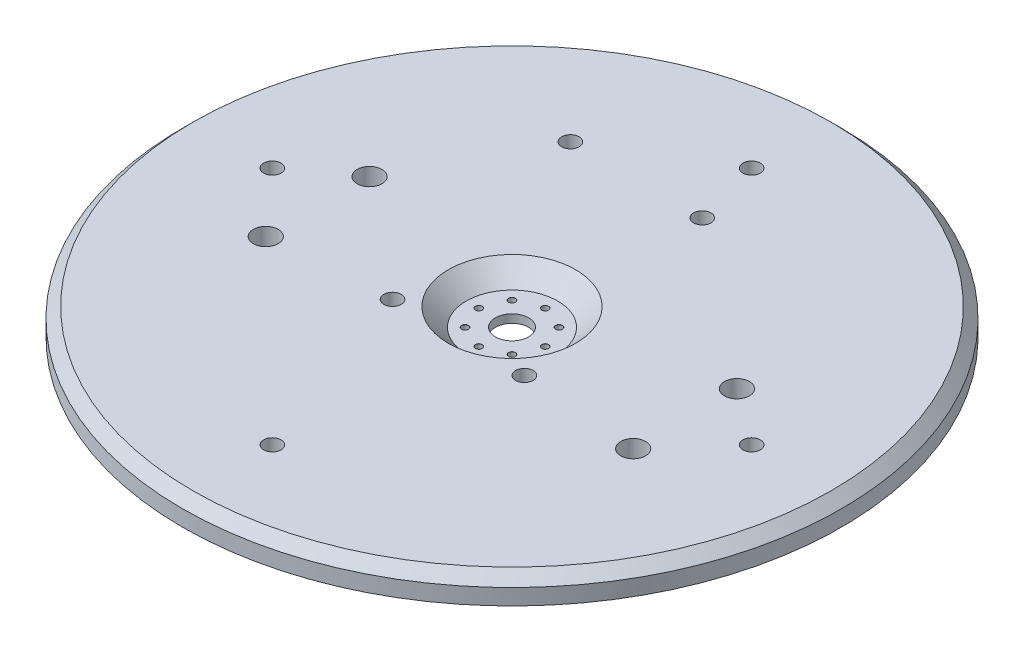
ISO-10303-21;
HEADER;
FILE_DESCRIPTION(('STEP AP214'),'2;1');
FILE_NAME('part.step','',(''),(''),'','','');
FILE_SCHEMA(('AUTOMOTIVE_DESIGN { 1 0 10303 214 1 1 1 1 }'));
ENDSEC;
DATA;
#1=APPLICATION_CONTEXT('core data for automotive mechanical design processes');
#2=APPLICATION_PROTOCOL_DEFINITION('international standard','automotive_design',2000,#1);
#3=PRODUCT_CONTEXT('',#1,'mechanical');
#4=PRODUCT('Part','Part','',(#3));
#5=PRODUCT_RELATED_PRODUCT_CATEGORY('part','',(#4));
#6=PRODUCT_DEFINITION_FORMATION('','',#4);
#7=PRODUCT_DEFINITION_CONTEXT('part definition',#1,'design');
#8=PRODUCT_DEFINITION('design','',#6,#7);
#9=PRODUCT_DEFINITION_SHAPE('','',#8);
#10=(LENGTH_UNIT() NAMED_UNIT(*) SI_UNIT(.MILLI.,.METRE.));
#11=(NAMED_UNIT(*) PLANE_ANGLE_UNIT() SI_UNIT($,.RADIAN.));
#12=(NAMED_UNIT(*) SI_UNIT($,.STERADIAN.) SOLID_ANGLE_UNIT());
#13=UNCERTAINTY_MEASURE_WITH_UNIT(LENGTH_MEASURE(1.E-05),#10,'distance_accuracy_value','');
#14=(GEOMETRIC_REPRESENTATION_CONTEXT(3) GLOBAL_UNCERTAINTY_ASSIGNED_CONTEXT((#13)) GLOBAL_UNIT_ASSIGNED_CONTEXT((#10,
#11,#12)) REPRESENTATION_CONTEXT('',''));
#15=CARTESIAN_POINT('',(0.,0.,0.));
#16=DIRECTION('',(0.,0.,1.));
#17=DIRECTION('',(1.,0.,0.));
#18=AXIS2_PLACEMENT_3D('',#15,#16,#17);
#19=CARTESIAN_POINT('',(0.,-3.175,0.));
#20=DIRECTION('',(0.,1.,0.));
#21=DIRECTION('',(0.,0.,1.));
#22=AXIS2_PLACEMENT_3D('',#19,#20,#21);
#23=CYLINDRICAL_SURFACE('',#22,4.);
#24=CARTESIAN_POINT('',(0.,-3.175,0.));
#25=DIRECTION('',(0.,1.,0.));
#26=DIRECTION('',(0.,0.,1.));
#27=AXIS2_PLACEMENT_3D('',#24,#25,#26);
#28=CIRCLE('',#27,4.);
#29=CARTESIAN_POINT('',(0.,-3.175,4.));
#30=VERTEX_POINT('',#29);
#31=EDGE_CURVE('E115',#30,#30,#28,.T.);
#32=ORIENTED_EDGE('',*,*,#31,.F.);
#33=EDGE_LOOP('',(#32));
#34=FACE_BOUND('',#33,.T.);
#35=CARTESIAN_POINT('',(0.,-1.175,0.));
#36=DIRECTION('',(0.,1.,0.));
#37=DIRECTION('',(0.,0.,1.));
#38=AXIS2_PLACEMENT_3D('',#35,#36,#37);
#39=CIRCLE('',#38,4.);
#40=CARTESIAN_POINT('',(0.,-1.175,4.));
#41=VERTEX_POINT('',#40);
#42=EDGE_CURVE('E118',#41,#41,#39,.F.);
#43=ORIENTED_EDGE('',*,*,#42,.F.);
#44=EDGE_LOOP('',(#43));
#45=FACE_BOUND('',#44,.T.);
#46=ADVANCED_FACE('F46',(#34,#45),#23,.F.);
#47=CARTESIAN_POINT('',(0.,3.175,0.));
#48=DIRECTION('',(0.,-1.,0.));
#49=DIRECTION('',(0.,0.,-1.));
#50=AXIS2_PLACEMENT_3D('',#47,#48,#49);
#51=CYLINDRICAL_SURFACE('',#50,79.375);
#52=CARTESIAN_POINT('',(0.,0.674999999999942,0.));
#53=DIRECTION('',(0.,1.,0.));
#54=DIRECTION('',(0.,0.,1.));
#55=AXIS2_PLACEMENT_3D('',#52,#53,#54);
#56=CIRCLE('',#55,79.375);
#57=CARTESIAN_POINT('',(0.,0.674999999999942,79.375));
#58=VERTEX_POINT('',#57);
#59=EDGE_CURVE('E11',#58,#58,#56,.F.);
#60=ORIENTED_EDGE('',*,*,#59,.T.);
#61=EDGE_LOOP('',(#60));
#62=FACE_BOUND('',#61,.T.);
#63=CARTESIAN_POINT('',(0.,-3.175,0.));
#64=DIRECTION('',(0.,1.,0.));
#65=DIRECTION('',(0.,0.,1.));
#66=AXIS2_PLACEMENT_3D('',#63,#64,#65);
#67=CIRCLE('',#66,79.375);
#68=CARTESIAN_POINT('',(0.,-3.175,79.375));
#69=VERTEX_POINT('',#68);
#70=EDGE_CURVE('E62',#69,#69,#67,.T.);
#71=ORIENTED_EDGE('',*,*,#70,.T.);
#72=EDGE_LOOP('',(#71));
#73=FACE_BOUND('',#72,.T.);
#74=ADVANCED_FACE('F227',(#62,#73),#51,.T.);
#75=CARTESIAN_POINT('',(0.,3.175,0.));
#76=DIRECTION('',(0.,1.,0.));
#77=DIRECTION('',(0.,0.,1.));
#78=AXIS2_PLACEMENT_3D('',#75,#76,#77);
#79=PLANE('',#78);
#80=CARTESIAN_POINT('',(-57.7233851013783,3.175,0.));
#81=DIRECTION('',(0.,1.,0.));
#82=DIRECTION('',(0.,0.,1.));
#83=AXIS2_PLACEMENT_3D('',#80,#81,#82);
#84=CIRCLE('',#83,2.1);
#85=CARTESIAN_POINT('',(-57.7233851013783,3.175,2.09999999999998));
#86=VERTEX_POINT('',#85);
#87=EDGE_CURVE('E217',#86,#86,#84,.T.);
#88=ORIENTED_EDGE('',*,*,#87,.F.);
#89=EDGE_LOOP('',(#88));
#90=FACE_BOUND('',#89,.T.);
#91=CARTESIAN_POINT('',(0.,3.175,-57.7233851013783));
#92=DIRECTION('',(0.,1.,0.));
#93=DIRECTION('',(0.,0.,1.));
#94=AXIS2_PLACEMENT_3D('',#91,#92,#93);
#95=CIRCLE('',#94,2.1);
#96=CARTESIAN_POINT('',(0.,3.175,-55.6233851013783));
#97=VERTEX_POINT('',#96);
#98=EDGE_CURVE('E211',#97,#97,#95,.T.);
#99=ORIENTED_EDGE('',*,*,#98,.F.);
#100=EDGE_LOOP('',(#99));
#101=FACE_BOUND('',#100,.T.);
#102=CARTESIAN_POINT('',(57.7233851013783,3.175,0.));
#103=DIRECTION('',(0.,1.,0.));
#104=DIRECTION('',(0.,0.,1.));
#105=AXIS2_PLACEMENT_3D('',#102,#103,#104);
#106=CIRCLE('',#105,2.1);
#107=CARTESIAN_POINT('',(57.7233851013783,3.175,2.09999999999998));
#108=VERTEX_POINT('',#107);
#109=EDGE_CURVE('E205',#108,#108,#106,.T.);
#110=ORIENTED_EDGE('',*,*,#109,.F.);
#111=EDGE_LOOP('',(#110));
#112=FACE_BOUND('',#111,.T.);
#113=CARTESIAN_POINT('',(0.,3.175,57.7233851013783));
#114=DIRECTION('',(0.,1.,0.));
#115=DIRECTION('',(0.,0.,1.));
#116=AXIS2_PLACEMENT_3D('',#113,#114,#115);
#117=CIRCLE('',#116,2.1);
#118=CARTESIAN_POINT('',(0.,3.175,59.8233851013783));
#119=VERTEX_POINT('',#118);
#120=EDGE_CURVE('E199',#119,#119,#117,.T.);
#121=ORIENTED_EDGE('',*,*,#120,.F.);
#122=EDGE_LOOP('',(#121));
#123=FACE_BOUND('',#122,.T.);
#124=CARTESIAN_POINT('',(0.,3.175,0.));
#125=DIRECTION('',(0.,1.,0.));
#126=DIRECTION('',(0.,0.,1.));
#127=AXIS2_PLACEMENT_3D('',#124,#125,#126);
#128=CIRCLE('',#127,76.8749999999999);
#129=CARTESIAN_POINT('',(0.,3.175,76.8749999999999));
#130=VERTEX_POINT('',#129);
#131=EDGE_CURVE('E54',#130,#130,#128,.T.);
#132=ORIENTED_EDGE('',*,*,#131,.T.);
#133=EDGE_LOOP('',(#132));
#134=FACE_BOUND('',#133,.T.);
#135=CARTESIAN_POINT('',(0.,3.175,0.));
#136=DIRECTION('',(0.,1.,0.));
#137=DIRECTION('',(0.,0.,1.));
#138=AXIS2_PLACEMENT_3D('',#135,#136,#137);
#139=CIRCLE('',#138,15.3500000000001);
#140=CARTESIAN_POINT('',(0.,3.175,15.3500000000001));
#141=VERTEX_POINT('',#140);
#142=EDGE_CURVE('E58',#141,#141,#139,.F.);
#143=ORIENTED_EDGE('',*,*,#142,.T.);
#144=EDGE_LOOP('',(#143));
#145=FACE_BOUND('',#144,.T.);
#146=CARTESIAN_POINT('',(-44.245,3.175,-9.94158367188883));
#147=DIRECTION('',(0.,1.,0.));
#148=DIRECTION('',(0.,0.,1.));
#149=AXIS2_PLACEMENT_3D('',#146,#147,#148);
#150=CIRCLE('',#149,3.);
#151=CARTESIAN_POINT('',(-44.245,3.175,-6.94158367188882));
#152=VERTEX_POINT('',#151);
#153=EDGE_CURVE('E112',#152,#152,#150,.T.);
#154=ORIENTED_EDGE('',*,*,#153,.F.);
#155=EDGE_LOOP('',(#154));
#156=FACE_BOUND('',#155,.T.);
#157=CARTESIAN_POINT('',(-44.245,3.175,15.0584163281112));
#158=DIRECTION('',(0.,1.,0.));
#159=DIRECTION('',(0.,0.,1.));
#160=AXIS2_PLACEMENT_3D('',#157,#158,#159);
#161=CIRCLE('',#160,3.);
#162=CARTESIAN_POINT('',(-44.245,3.175,18.0584163281112));
#163=VERTEX_POINT('',#162);
#164=EDGE_CURVE('E106',#163,#163,#161,.T.);
#165=ORIENTED_EDGE('',*,*,#164,.F.);
#166=EDGE_LOOP('',(#165));
#167=FACE_BOUND('',#166,.T.);
#168=CARTESIAN_POINT('',(44.245,3.175,-9.94158367188884));
#169=DIRECTION('',(0.,1.,0.));
#170=DIRECTION('',(0.,0.,1.));
#171=AXIS2_PLACEMENT_3D('',#168,#169,#170);
#172=CIRCLE('',#171,3.);
#173=CARTESIAN_POINT('',(44.245,3.175,-6.94158367188883));
#174=VERTEX_POINT('',#173);
#175=EDGE_CURVE('E100',#174,#174,#172,.T.);
#176=ORIENTED_EDGE('',*,*,#175,.F.);
#177=EDGE_LOOP('',(#176));
#178=FACE_BOUND('',#177,.T.);
#179=CARTESIAN_POINT('',(44.245,3.175,15.0584163281112));
#180=DIRECTION('',(0.,1.,0.));
#181=DIRECTION('',(0.,0.,1.));
#182=AXIS2_PLACEMENT_3D('',#179,#180,#181);
#183=CIRCLE('',#182,3.);
#184=CARTESIAN_POINT('',(44.245,3.175,18.0584163281112));
#185=VERTEX_POINT('',#184);
#186=EDGE_CURVE('E94',#185,#185,#183,.T.);
#187=ORIENTED_EDGE('',*,*,#186,.F.);
#188=EDGE_LOOP('',(#187));
#189=FACE_BOUND('',#188,.T.);
#190=CARTESIAN_POINT('',(-27.3188086,3.175,-41.38978387));
#191=DIRECTION('',(0.,1.,0.));
#192=DIRECTION('',(0.,0.,1.));
#193=AXIS2_PLACEMENT_3D('',#190,#191,#192);
#194=CIRCLE('',#193,2.1);
#195=CARTESIAN_POINT('',(-27.3188086,3.175,-39.28978387));
#196=VERTEX_POINT('',#195);
#197=EDGE_CURVE('E88',#196,#196,#194,.T.);
#198=ORIENTED_EDGE('',*,*,#197,.F.);
#199=EDGE_LOOP('',(#198));
#200=FACE_BOUND('',#199,.T.);
#201=CARTESIAN_POINT('',(4.43119139999999,3.175,-41.38978387));
#202=DIRECTION('',(0.,1.,0.));
#203=DIRECTION('',(0.,0.,1.));
#204=AXIS2_PLACEMENT_3D('',#201,#202,#203);
#205=CIRCLE('',#204,2.1);
#206=CARTESIAN_POINT('',(4.43119139999999,3.175,-39.28978387));
#207=VERTEX_POINT('',#206);
#208=EDGE_CURVE('E82',#207,#207,#205,.T.);
#209=ORIENTED_EDGE('',*,*,#208,.F.);
#210=EDGE_LOOP('',(#209));
#211=FACE_BOUND('',#210,.T.);
#212=CARTESIAN_POINT('',(-15.875,3.175,12.895910708));
#213=DIRECTION('',(0.,1.,0.));
#214=DIRECTION('',(0.,0.,1.));
#215=AXIS2_PLACEMENT_3D('',#212,#213,#214);
#216=CIRCLE('',#215,2.1);
#217=CARTESIAN_POINT('',(-15.875,3.175,14.995910708));
#218=VERTEX_POINT('',#217);
#219=EDGE_CURVE('E76',#218,#218,#216,.T.);
#220=ORIENTED_EDGE('',*,*,#219,.F.);
#221=EDGE_LOOP('',(#220));
#222=FACE_BOUND('',#221,.T.);
#223=CARTESIAN_POINT('',(15.875,3.175,12.895910708));
#224=DIRECTION('',(0.,1.,0.));
#225=DIRECTION('',(0.,0.,1.));
#226=AXIS2_PLACEMENT_3D('',#223,#224,#225);
#227=CIRCLE('',#226,2.1);
#228=CARTESIAN_POINT('',(15.875,3.175,14.995910708));
#229=VERTEX_POINT('',#228);
#230=EDGE_CURVE('E70',#229,#229,#227,.T.);
#231=ORIENTED_EDGE('',*,*,#230,.F.);
#232=EDGE_LOOP('',(#231));
#233=FACE_BOUND('',#232,.T.);
#234=ADVANCED_FACE('F223',(#90,#101,#112,#123,#134,#145,#156,#167,#178,#189,#200,#211,#222,
#233),#79,.T.);
#235=CARTESIAN_POINT('',(0.,-3.175,0.));
#236=DIRECTION('',(0.,1.,0.));
#237=DIRECTION('',(0.,0.,1.));
#238=AXIS2_PLACEMENT_3D('',#235,#236,#237);
#239=PLANE('',#238);
#240=CARTESIAN_POINT('',(-57.7233851013783,-3.175,0.));
#241=DIRECTION('',(0.,1.,0.));
#242=DIRECTION('',(0.,0.,1.));
#243=AXIS2_PLACEMENT_3D('',#240,#241,#242);
#244=CIRCLE('',#243,2.1);
#245=CARTESIAN_POINT('',(-57.7233851013783,-3.175,2.09999999999998));
#246=VERTEX_POINT('',#245);
#247=EDGE_CURVE('E214',#246,#246,#244,.T.);
#248=ORIENTED_EDGE('',*,*,#247,.T.);
#249=EDGE_LOOP('',(#248));
#250=FACE_BOUND('',#249,.T.);
#251=CARTESIAN_POINT('',(0.,-3.175,-57.7233851013783));
#252=DIRECTION('',(0.,1.,0.));
#253=DIRECTION('',(0.,0.,1.));
#254=AXIS2_PLACEMENT_3D('',#251,#252,#253);
#255=CIRCLE('',#254,2.1);
#256=CARTESIAN_POINT('',(0.,-3.175,-55.6233851013783));
#257=VERTEX_POINT('',#256);
#258=EDGE_CURVE('E208',#257,#257,#255,.T.);
#259=ORIENTED_EDGE('',*,*,#258,.T.);
#260=EDGE_LOOP('',(#259));
#261=FACE_BOUND('',#260,.T.);
#262=CARTESIAN_POINT('',(57.7233851013783,-3.175,0.));
#263=DIRECTION('',(0.,1.,0.));
#264=DIRECTION('',(0.,0.,1.));
#265=AXIS2_PLACEMENT_3D('',#262,#263,#264);
#266=CIRCLE('',#265,2.1);
#267=CARTESIAN_POINT('',(57.7233851013783,-3.175,2.09999999999998));
#268=VERTEX_POINT('',#267);
#269=EDGE_CURVE('E202',#268,#268,#266,.T.);
#270=ORIENTED_EDGE('',*,*,#269,.T.);
#271=EDGE_LOOP('',(#270));
#272=FACE_BOUND('',#271,.T.);
#273=CARTESIAN_POINT('',(0.,-3.175,57.7233851013783));
#274=DIRECTION('',(0.,1.,0.));
#275=DIRECTION('',(0.,0.,1.));
#276=AXIS2_PLACEMENT_3D('',#273,#274,#275);
#277=CIRCLE('',#276,2.1);
#278=CARTESIAN_POINT('',(0.,-3.175,59.8233851013783));
#279=VERTEX_POINT('',#278);
#280=EDGE_CURVE('E196',#279,#279,#277,.T.);
#281=ORIENTED_EDGE('',*,*,#280,.T.);
#282=EDGE_LOOP('',(#281));
#283=FACE_BOUND('',#282,.T.);
#284=CARTESIAN_POINT('',(-8.,-3.175,0.));
#285=DIRECTION('',(0.,1.,0.));
#286=DIRECTION('',(0.,0.,1.));
#287=AXIS2_PLACEMENT_3D('',#284,#285,#286);
#288=CIRCLE('',#287,0.799999999999997);
#289=CARTESIAN_POINT('',(-8.,-3.175,0.799999999999999));
#290=VERTEX_POINT('',#289);
#291=EDGE_CURVE('E187',#290,#290,#288,.T.);
#292=ORIENTED_EDGE('',*,*,#291,.T.);
#293=EDGE_LOOP('',(#292));
#294=FACE_BOUND('',#293,.T.);
#295=CARTESIAN_POINT('',(-5.65685424949238,-3.175,-5.65685424949238));
#296=DIRECTION('',(0.,1.,0.));
#297=DIRECTION('',(0.,0.,1.));
#298=AXIS2_PLACEMENT_3D('',#295,#296,#297);
#299=CIRCLE('',#298,0.799999999999997);
#300=CARTESIAN_POINT('',(-5.65685424949238,-3.175,-4.85685424949238));
#301=VERTEX_POINT('',#300);
#302=EDGE_CURVE('E178',#301,#301,#299,.T.);
#303=ORIENTED_EDGE('',*,*,#302,.T.);
#304=EDGE_LOOP('',(#303));
#305=FACE_BOUND('',#304,.T.);
#306=CARTESIAN_POINT('',(0.,-3.175,-8.));
#307=DIRECTION('',(0.,1.,0.));
#308=DIRECTION('',(0.,0.,1.));
#309=AXIS2_PLACEMENT_3D('',#306,#307,#308);
#310=CIRCLE('',#309,0.799999999999997);
#311=CARTESIAN_POINT('',(0.,-3.175,-7.2));
#312=VERTEX_POINT('',#311);
#313=EDGE_CURVE('E169',#312,#312,#310,.T.);
#314=ORIENTED_EDGE('',*,*,#313,.T.);
#315=EDGE_LOOP('',(#314));
#316=FACE_BOUND('',#315,.T.);
#317=CARTESIAN_POINT('',(5.65685424949238,-3.175,-5.65685424949238));
#318=DIRECTION('',(0.,1.,0.));
#319=DIRECTION('',(0.,0.,1.));
#320=AXIS2_PLACEMENT_3D('',#317,#318,#319);
#321=CIRCLE('',#320,0.799999999999997);
#322=CARTESIAN_POINT('',(5.65685424949238,-3.175,-4.85685424949239));
#323=VERTEX_POINT('',#322);
#324=EDGE_CURVE('E160',#323,#323,#321,.T.);
#325=ORIENTED_EDGE('',*,*,#324,.T.);
#326=EDGE_LOOP('',(#325));
#327=FACE_BOUND('',#326,.T.);
#328=CARTESIAN_POINT('',(8.,-3.175,0.));
#329=DIRECTION('',(0.,1.,0.));
#330=DIRECTION('',(0.,0.,1.));
#331=AXIS2_PLACEMENT_3D('',#328,#329,#330);
#332=CIRCLE('',#331,0.799999999999997);
#333=CARTESIAN_POINT('',(8.,-3.175,0.799999999999997));
#334=VERTEX_POINT('',#333);
#335=EDGE_CURVE('E151',#334,#334,#332,.T.);
#336=ORIENTED_EDGE('',*,*,#335,.T.);
#337=EDGE_LOOP('',(#336));
#338=FACE_BOUND('',#337,.T.);
#339=CARTESIAN_POINT('',(5.65685424949238,-3.175,5.65685424949238));
#340=DIRECTION('',(0.,1.,0.));
#341=DIRECTION('',(0.,0.,1.));
#342=AXIS2_PLACEMENT_3D('',#339,#340,#341);
#343=CIRCLE('',#342,0.799999999999997);
#344=CARTESIAN_POINT('',(5.65685424949238,-3.175,6.45685424949238));
#345=VERTEX_POINT('',#344);
#346=EDGE_CURVE('E142',#345,#345,#343,.T.);
#347=ORIENTED_EDGE('',*,*,#346,.T.);
#348=EDGE_LOOP('',(#347));
#349=FACE_BOUND('',#348,.T.);
#350=CARTESIAN_POINT('',(0.,-3.175,8.));
#351=DIRECTION('',(0.,1.,0.));
#352=DIRECTION('',(0.,0.,1.));
#353=AXIS2_PLACEMENT_3D('',#350,#351,#352);
#354=CIRCLE('',#353,0.799999999999997);
#355=CARTESIAN_POINT('',(0.,-3.175,8.8));
#356=VERTEX_POINT('',#355);
#357=EDGE_CURVE('E133',#356,#356,#354,.T.);
#358=ORIENTED_EDGE('',*,*,#357,.T.);
#359=EDGE_LOOP('',(#358));
#360=FACE_BOUND('',#359,.T.);
#361=CARTESIAN_POINT('',(-5.65685424949238,-3.175,5.65685424949238));
#362=DIRECTION('',(0.,1.,0.));
#363=DIRECTION('',(0.,0.,1.));
#364=AXIS2_PLACEMENT_3D('',#361,#362,#363);
#365=CIRCLE('',#364,0.799999999999997);
#366=CARTESIAN_POINT('',(-5.65685424949238,-3.175,6.45685424949238));
#367=VERTEX_POINT('',#366);
#368=EDGE_CURVE('E124',#367,#367,#365,.T.);
#369=ORIENTED_EDGE('',*,*,#368,.T.);
#370=EDGE_LOOP('',(#369));
#371=FACE_BOUND('',#370,.T.);
#372=ORIENTED_EDGE('',*,*,#31,.T.);
#373=EDGE_LOOP('',(#372));
#374=FACE_BOUND('',#373,.T.);
#375=CARTESIAN_POINT('',(-44.245,-3.175,-9.94158367188883));
#376=DIRECTION('',(0.,1.,0.));
#377=DIRECTION('',(0.,0.,1.));
#378=AXIS2_PLACEMENT_3D('',#375,#376,#377);
#379=CIRCLE('',#378,3.);
#380=CARTESIAN_POINT('',(-44.245,-3.175,-6.94158367188883));
#381=VERTEX_POINT('',#380);
#382=EDGE_CURVE('E109',#381,#381,#379,.T.);
#383=ORIENTED_EDGE('',*,*,#382,.T.);
#384=EDGE_LOOP('',(#383));
#385=FACE_BOUND('',#384,.T.);
#386=CARTESIAN_POINT('',(-44.245,-3.175,15.0584163281112));
#387=DIRECTION('',(0.,1.,0.));
#388=DIRECTION('',(0.,0.,1.));
#389=AXIS2_PLACEMENT_3D('',#386,#387,#388);
#390=CIRCLE('',#389,3.);
#391=CARTESIAN_POINT('',(-44.245,-3.175,18.0584163281112));
#392=VERTEX_POINT('',#391);
#393=EDGE_CURVE('E103',#392,#392,#390,.T.);
#394=ORIENTED_EDGE('',*,*,#393,.T.);
#395=EDGE_LOOP('',(#394));
#396=FACE_BOUND('',#395,.T.);
#397=CARTESIAN_POINT('',(44.245,-3.175,-9.94158367188884));
#398=DIRECTION('',(0.,1.,0.));
#399=DIRECTION('',(0.,0.,1.));
#400=AXIS2_PLACEMENT_3D('',#397,#398,#399);
#401=CIRCLE('',#400,3.);
#402=CARTESIAN_POINT('',(44.245,-3.175,-6.94158367188884));
#403=VERTEX_POINT('',#402);
#404=EDGE_CURVE('E97',#403,#403,#401,.T.);
#405=ORIENTED_EDGE('',*,*,#404,.T.);
#406=EDGE_LOOP('',(#405));
#407=FACE_BOUND('',#406,.T.);
#408=CARTESIAN_POINT('',(44.245,-3.175,15.0584163281112));
#409=DIRECTION('',(0.,1.,0.));
#410=DIRECTION('',(0.,0.,1.));
#411=AXIS2_PLACEMENT_3D('',#408,#409,#410);
#412=CIRCLE('',#411,3.);
#413=CARTESIAN_POINT('',(44.245,-3.175,18.0584163281112));
#414=VERTEX_POINT('',#413);
#415=EDGE_CURVE('E91',#414,#414,#412,.T.);
#416=ORIENTED_EDGE('',*,*,#415,.T.);
#417=EDGE_LOOP('',(#416));
#418=FACE_BOUND('',#417,.T.);
#419=CARTESIAN_POINT('',(-27.3188086,-3.175,-41.38978387));
#420=DIRECTION('',(0.,1.,0.));
#421=DIRECTION('',(0.,0.,1.));
#422=AXIS2_PLACEMENT_3D('',#419,#420,#421);
#423=CIRCLE('',#422,2.1);
#424=CARTESIAN_POINT('',(-27.3188086,-3.175,-39.28978387));
#425=VERTEX_POINT('',#424);
#426=EDGE_CURVE('E85',#425,#425,#423,.T.);
#427=ORIENTED_EDGE('',*,*,#426,.T.);
#428=EDGE_LOOP('',(#427));
#429=FACE_BOUND('',#428,.T.);
#430=CARTESIAN_POINT('',(4.43119139999999,-3.175,-41.38978387));
#431=DIRECTION('',(0.,1.,0.));
#432=DIRECTION('',(0.,0.,1.));
#433=AXIS2_PLACEMENT_3D('',#430,#431,#432);
#434=CIRCLE('',#433,2.1);
#435=CARTESIAN_POINT('',(4.43119139999999,-3.175,-39.28978387));
#436=VERTEX_POINT('',#435);
#437=EDGE_CURVE('E79',#436,#436,#434,.T.);
#438=ORIENTED_EDGE('',*,*,#437,.T.);
#439=EDGE_LOOP('',(#438));
#440=FACE_BOUND('',#439,.T.);
#441=CARTESIAN_POINT('',(-15.875,-3.175,12.895910708));
#442=DIRECTION('',(0.,1.,0.));
#443=DIRECTION('',(0.,0.,1.));
#444=AXIS2_PLACEMENT_3D('',#441,#442,#443);
#445=CIRCLE('',#444,2.1);
#446=CARTESIAN_POINT('',(-15.875,-3.175,14.995910708));
#447=VERTEX_POINT('',#446);
#448=EDGE_CURVE('E73',#447,#447,#445,.T.);
#449=ORIENTED_EDGE('',*,*,#448,.T.);
#450=EDGE_LOOP('',(#449));
#451=FACE_BOUND('',#450,.T.);
#452=CARTESIAN_POINT('',(15.875,-3.175,12.895910708));
#453=DIRECTION('',(0.,1.,0.));
#454=DIRECTION('',(0.,0.,1.));
#455=AXIS2_PLACEMENT_3D('',#452,#453,#454);
#456=CIRCLE('',#455,2.1);
#457=CARTESIAN_POINT('',(15.875,-3.175,14.995910708));
#458=VERTEX_POINT('',#457);
#459=EDGE_CURVE('E67',#458,#458,#456,.T.);
#460=ORIENTED_EDGE('',*,*,#459,.T.);
#461=EDGE_LOOP('',(#460));
#462=FACE_BOUND('',#461,.T.);
#463=ORIENTED_EDGE('',*,*,#70,.F.);
#464=EDGE_LOOP('',(#463));
#465=FACE_BOUND('',#464,.T.);
#466=ADVANCED_FACE('F226',(#250,#261,#272,#283,#294,#305,#316,#327,#338,#349,#360,#371,#374,
#385,#396,#407,#418,#429,#440,#451,#462,#465),#239,.F.);
#467=CARTESIAN_POINT('',(15.875,3.175,12.895910708));
#468=DIRECTION('',(0.,1.,0.));
#469=DIRECTION('',(0.,0.,1.));
#470=AXIS2_PLACEMENT_3D('',#467,#468,#469);
#471=CYLINDRICAL_SURFACE('',#470,2.1);
#472=ORIENTED_EDGE('',*,*,#459,.F.);
#473=EDGE_LOOP('',(#472));
#474=FACE_BOUND('',#473,.T.);
#475=ORIENTED_EDGE('',*,*,#230,.T.);
#476=EDGE_LOOP('',(#475));
#477=FACE_BOUND('',#476,.T.);
#478=ADVANCED_FACE('F253',(#474,#477),#471,.F.);
#479=CARTESIAN_POINT('',(-15.875,3.175,12.895910708));
#480=DIRECTION('',(0.,1.,0.));
#481=DIRECTION('',(0.,0.,1.));
#482=AXIS2_PLACEMENT_3D('',#479,#480,#481);
#483=CYLINDRICAL_SURFACE('',#482,2.1);
#484=ORIENTED_EDGE('',*,*,#448,.F.);
#485=EDGE_LOOP('',(#484));
#486=FACE_BOUND('',#485,.T.);
#487=ORIENTED_EDGE('',*,*,#219,.T.);
#488=EDGE_LOOP('',(#487));
#489=FACE_BOUND('',#488,.T.);
#490=ADVANCED_FACE('F255',(#486,#489),#483,.F.);
#491=CARTESIAN_POINT('',(4.43119139999999,3.175,-41.38978387));
#492=DIRECTION('',(0.,1.,0.));
#493=DIRECTION('',(0.,0.,1.));
#494=AXIS2_PLACEMENT_3D('',#491,#492,#493);
#495=CYLINDRICAL_SURFACE('',#494,2.1);
#496=ORIENTED_EDGE('',*,*,#437,.F.);
#497=EDGE_LOOP('',(#496));
#498=FACE_BOUND('',#497,.T.);
#499=ORIENTED_EDGE('',*,*,#208,.T.);
#500=EDGE_LOOP('',(#499));
#501=FACE_BOUND('',#500,.T.);
#502=ADVANCED_FACE('F262',(#498,#501),#495,.F.);
#503=CARTESIAN_POINT('',(-27.3188086,3.175,-41.38978387));
#504=DIRECTION('',(0.,1.,0.));
#505=DIRECTION('',(0.,0.,1.));
#506=AXIS2_PLACEMENT_3D('',#503,#504,#505);
#507=CYLINDRICAL_SURFACE('',#506,2.1);
#508=ORIENTED_EDGE('',*,*,#426,.F.);
#509=EDGE_LOOP('',(#508));
#510=FACE_BOUND('',#509,.T.);
#511=ORIENTED_EDGE('',*,*,#197,.T.);
#512=EDGE_LOOP('',(#511));
#513=FACE_BOUND('',#512,.T.);
#514=ADVANCED_FACE('F296',(#510,#513),#507,.F.);
#515=CARTESIAN_POINT('',(44.245,3.175,15.0584163281112));
#516=DIRECTION('',(0.,1.,0.));
#517=DIRECTION('',(0.,0.,1.));
#518=AXIS2_PLACEMENT_3D('',#515,#516,#517);
#519=CYLINDRICAL_SURFACE('',#518,3.);
#520=ORIENTED_EDGE('',*,*,#415,.F.);
#521=EDGE_LOOP('',(#520));
#522=FACE_BOUND('',#521,.T.);
#523=ORIENTED_EDGE('',*,*,#186,.T.);
#524=EDGE_LOOP('',(#523));
#525=FACE_BOUND('',#524,.T.);
#526=ADVANCED_FACE('F292',(#522,#525),#519,.F.);
#527=CARTESIAN_POINT('',(44.245,3.175,-9.94158367188884));
#528=DIRECTION('',(0.,1.,0.));
#529=DIRECTION('',(0.,0.,1.));
#530=AXIS2_PLACEMENT_3D('',#527,#528,#529);
#531=CYLINDRICAL_SURFACE('',#530,3.);
#532=ORIENTED_EDGE('',*,*,#404,.F.);
#533=EDGE_LOOP('',(#532));
#534=FACE_BOUND('',#533,.T.);
#535=ORIENTED_EDGE('',*,*,#175,.T.);
#536=EDGE_LOOP('',(#535));
#537=FACE_BOUND('',#536,.T.);
#538=ADVANCED_FACE('F288',(#534,#537),#531,.F.);
#539=CARTESIAN_POINT('',(-44.245,3.175,15.0584163281112));
#540=DIRECTION('',(0.,1.,0.));
#541=DIRECTION('',(0.,0.,1.));
#542=AXIS2_PLACEMENT_3D('',#539,#540,#541);
#543=CYLINDRICAL_SURFACE('',#542,3.);
#544=ORIENTED_EDGE('',*,*,#393,.F.);
#545=EDGE_LOOP('',(#544));
#546=FACE_BOUND('',#545,.T.);
#547=ORIENTED_EDGE('',*,*,#164,.T.);
#548=EDGE_LOOP('',(#547));
#549=FACE_BOUND('',#548,.T.);
#550=ADVANCED_FACE('F284',(#546,#549),#543,.F.);
#551=CARTESIAN_POINT('',(-44.245,3.175,-9.94158367188883));
#552=DIRECTION('',(0.,1.,0.));
#553=DIRECTION('',(0.,0.,1.));
#554=AXIS2_PLACEMENT_3D('',#551,#552,#553);
#555=CYLINDRICAL_SURFACE('',#554,3.);
#556=ORIENTED_EDGE('',*,*,#382,.F.);
#557=EDGE_LOOP('',(#556));
#558=FACE_BOUND('',#557,.T.);
#559=ORIENTED_EDGE('',*,*,#153,.T.);
#560=EDGE_LOOP('',(#559));
#561=FACE_BOUND('',#560,.T.);
#562=ADVANCED_FACE('F281',(#558,#561),#555,.F.);
#563=CARTESIAN_POINT('',(0.,-1.175,0.));
#564=DIRECTION('',(0.,1.,0.));
#565=DIRECTION('',(0.,0.,1.));
#566=AXIS2_PLACEMENT_3D('',#563,#564,#565);
#567=PLANE('',#566);
#568=CARTESIAN_POINT('',(-8.,-1.175,0.));
#569=DIRECTION('',(0.,1.,0.));
#570=DIRECTION('',(0.,0.,1.));
#571=AXIS2_PLACEMENT_3D('',#568,#569,#570);
#572=CIRCLE('',#571,0.824999999999999);
#573=CARTESIAN_POINT('',(-8.,-1.175,0.825000000000001));
#574=VERTEX_POINT('',#573);
#575=EDGE_CURVE('E193',#574,#574,#572,.T.);
#576=ORIENTED_EDGE('',*,*,#575,.F.);
#577=EDGE_LOOP('',(#576));
#578=FACE_BOUND('',#577,.T.);
#579=CARTESIAN_POINT('',(-5.65685424949238,-1.175,-5.65685424949238));
#580=DIRECTION('',(0.,1.,0.));
#581=DIRECTION('',(0.,0.,1.));
#582=AXIS2_PLACEMENT_3D('',#579,#580,#581);
#583=CIRCLE('',#582,0.824999999999999);
#584=CARTESIAN_POINT('',(-5.65685424949238,-1.175,-4.83185424949238));
#585=VERTEX_POINT('',#584);
#586=EDGE_CURVE('E184',#585,#585,#583,.T.);
#587=ORIENTED_EDGE('',*,*,#586,.F.);
#588=EDGE_LOOP('',(#587));
#589=FACE_BOUND('',#588,.T.);
#590=CARTESIAN_POINT('',(0.,-1.175,-8.));
#591=DIRECTION('',(0.,1.,0.));
#592=DIRECTION('',(0.,0.,1.));
#593=AXIS2_PLACEMENT_3D('',#590,#591,#592);
#594=CIRCLE('',#593,0.824999999999999);
#595=CARTESIAN_POINT('',(0.,-1.175,-7.175));
#596=VERTEX_POINT('',#595);
#597=EDGE_CURVE('E175',#596,#596,#594,.T.);
#598=ORIENTED_EDGE('',*,*,#597,.F.);
#599=EDGE_LOOP('',(#598));
#600=FACE_BOUND('',#599,.T.);
#601=CARTESIAN_POINT('',(5.65685424949238,-1.175,-5.65685424949238));
#602=DIRECTION('',(0.,1.,0.));
#603=DIRECTION('',(0.,0.,1.));
#604=AXIS2_PLACEMENT_3D('',#601,#602,#603);
#605=CIRCLE('',#604,0.824999999999999);
#606=CARTESIAN_POINT('',(5.65685424949238,-1.175,-4.83185424949238));
#607=VERTEX_POINT('',#606);
#608=EDGE_CURVE('E166',#607,#607,#605,.T.);
#609=ORIENTED_EDGE('',*,*,#608,.F.);
#610=EDGE_LOOP('',(#609));
#611=FACE_BOUND('',#610,.T.);
#612=CARTESIAN_POINT('',(8.,-1.175,0.));
#613=DIRECTION('',(0.,1.,0.));
#614=DIRECTION('',(0.,0.,1.));
#615=AXIS2_PLACEMENT_3D('',#612,#613,#614);
#616=CIRCLE('',#615,0.824999999999999);
#617=CARTESIAN_POINT('',(8.,-1.175,0.824999999999999));
#618=VERTEX_POINT('',#617);
#619=EDGE_CURVE('E157',#618,#618,#616,.T.);
#620=ORIENTED_EDGE('',*,*,#619,.F.);
#621=EDGE_LOOP('',(#620));
#622=FACE_BOUND('',#621,.T.);
#623=CARTESIAN_POINT('',(5.65685424949238,-1.175,5.65685424949238));
#624=DIRECTION('',(0.,1.,0.));
#625=DIRECTION('',(0.,0.,1.));
#626=AXIS2_PLACEMENT_3D('',#623,#624,#625);
#627=CIRCLE('',#626,0.824999999999999);
#628=CARTESIAN_POINT('',(5.65685424949238,-1.175,6.48185424949238));
#629=VERTEX_POINT('',#628);
#630=EDGE_CURVE('E148',#629,#629,#627,.T.);
#631=ORIENTED_EDGE('',*,*,#630,.F.);
#632=EDGE_LOOP('',(#631));
#633=FACE_BOUND('',#632,.T.);
#634=CARTESIAN_POINT('',(0.,-1.175,8.));
#635=DIRECTION('',(0.,1.,0.));
#636=DIRECTION('',(0.,0.,1.));
#637=AXIS2_PLACEMENT_3D('',#634,#635,#636);
#638=CIRCLE('',#637,0.824999999999999);
#639=CARTESIAN_POINT('',(0.,-1.175,8.825));
#640=VERTEX_POINT('',#639);
#641=EDGE_CURVE('E139',#640,#640,#638,.T.);
#642=ORIENTED_EDGE('',*,*,#641,.F.);
#643=EDGE_LOOP('',(#642));
#644=FACE_BOUND('',#643,.T.);
#645=CARTESIAN_POINT('',(-5.65685424949238,-1.175,5.65685424949238));
#646=DIRECTION('',(0.,1.,0.));
#647=DIRECTION('',(0.,0.,1.));
#648=AXIS2_PLACEMENT_3D('',#645,#646,#647);
#649=CIRCLE('',#648,0.824999999999999);
#650=CARTESIAN_POINT('',(-5.65685424949238,-1.175,6.48185424949238));
#651=VERTEX_POINT('',#650);
#652=EDGE_CURVE('E130',#651,#651,#649,.T.);
#653=ORIENTED_EDGE('',*,*,#652,.F.);
#654=EDGE_LOOP('',(#653));
#655=FACE_BOUND('',#654,.T.);
#656=CARTESIAN_POINT('',(0.,-1.175,0.));
#657=DIRECTION('',(0.,1.,0.));
#658=DIRECTION('',(0.,0.,1.));
#659=AXIS2_PLACEMENT_3D('',#656,#657,#658);
#660=CIRCLE('',#659,11.);
#661=CARTESIAN_POINT('',(0.,-1.175,11.));
#662=VERTEX_POINT('',#661);
#663=EDGE_CURVE('E121',#662,#662,#660,.F.);
#664=ORIENTED_EDGE('',*,*,#663,.F.);
#665=EDGE_LOOP('',(#664));
#666=FACE_BOUND('',#665,.T.);
#667=ORIENTED_EDGE('',*,*,#42,.T.);
#668=EDGE_LOOP('',(#667));
#669=FACE_BOUND('',#668,.T.);
#670=ADVANCED_FACE('F279',(#578,#589,#600,#611,#622,#633,#644,#655,#666,#669),#567,.T.);
#671=CARTESIAN_POINT('',(0.,-1.17500000000004,0.));
#672=DIRECTION('',(0.,1.,0.));
#673=DIRECTION('',(0.,0.,1.));
#674=AXIS2_PLACEMENT_3D('',#671,#672,#673);
#675=CONICAL_SURFACE('',#674,11.,0.78539816339745);
#676=ORIENTED_EDGE('',*,*,#142,.F.);
#677=EDGE_LOOP('',(#676));
#678=FACE_BOUND('',#677,.T.);
#679=ORIENTED_EDGE('',*,*,#663,.T.);
#680=EDGE_LOOP('',(#679));
#681=FACE_BOUND('',#680,.T.);
#682=ADVANCED_FACE('F343',(#678,#681),#675,.F.);
#683=CARTESIAN_POINT('',(-5.65685424949238,-1.175,5.65685424949238));
#684=DIRECTION('',(0.,1.,0.));
#685=DIRECTION('',(0.,0.,1.));
#686=AXIS2_PLACEMENT_3D('',#683,#684,#685);
#687=CYLINDRICAL_SURFACE('',#686,0.799999999999997);
#688=ORIENTED_EDGE('',*,*,#368,.F.);
#689=EDGE_LOOP('',(#688));
#690=FACE_BOUND('',#689,.T.);
#691=CARTESIAN_POINT('',(-5.65685424949238,-1.2,5.65685424949238));
#692=DIRECTION('',(0.,1.,0.));
#693=DIRECTION('',(0.,0.,1.));
#694=AXIS2_PLACEMENT_3D('',#691,#692,#693);
#695=CIRCLE('',#694,0.799999999999997);
#696=CARTESIAN_POINT('',(-5.65685424949238,-1.2,6.45685424949238));
#697=VERTEX_POINT('',#696);
#698=EDGE_CURVE('E127',#697,#697,#695,.T.);
#699=ORIENTED_EDGE('',*,*,#698,.T.);
#700=EDGE_LOOP('',(#699));
#701=FACE_BOUND('',#700,.T.);
#702=ADVANCED_FACE('F351',(#690,#701),#687,.F.);
#703=CARTESIAN_POINT('',(-5.65685424949238,-1.175,5.65685424949238));
#704=DIRECTION('',(0.,1.,0.));
#705=DIRECTION('',(0.,0.,1.));
#706=AXIS2_PLACEMENT_3D('',#703,#704,#705);
#707=CONICAL_SURFACE('',#706,0.824999999999999,0.785398163397518);
#708=ORIENTED_EDGE('',*,*,#698,.F.);
#709=EDGE_LOOP('',(#708));
#710=FACE_BOUND('',#709,.T.);
#711=ORIENTED_EDGE('',*,*,#652,.T.);
#712=EDGE_LOOP('',(#711));
#713=FACE_BOUND('',#712,.T.);
#714=ADVANCED_FACE('F357',(#710,#713),#707,.F.);
#715=CARTESIAN_POINT('',(0.,-1.175,8.));
#716=DIRECTION('',(0.,1.,0.));
#717=DIRECTION('',(0.,0.,1.));
#718=AXIS2_PLACEMENT_3D('',#715,#716,#717);
#719=CYLINDRICAL_SURFACE('',#718,0.799999999999997);
#720=ORIENTED_EDGE('',*,*,#357,.F.);
#721=EDGE_LOOP('',(#720));
#722=FACE_BOUND('',#721,.T.);
#723=CARTESIAN_POINT('',(0.,-1.2,8.));
#724=DIRECTION('',(0.,1.,0.));
#725=DIRECTION('',(0.,0.,1.));
#726=AXIS2_PLACEMENT_3D('',#723,#724,#725);
#727=CIRCLE('',#726,0.799999999999997);
#728=CARTESIAN_POINT('',(0.,-1.2,8.8));
#729=VERTEX_POINT('',#728);
#730=EDGE_CURVE('E136',#729,#729,#727,.T.);
#731=ORIENTED_EDGE('',*,*,#730,.T.);
#732=EDGE_LOOP('',(#731));
#733=FACE_BOUND('',#732,.T.);
#734=ADVANCED_FACE('F364',(#722,#733),#719,.F.);
#735=CARTESIAN_POINT('',(0.,-1.175,8.));
#736=DIRECTION('',(0.,1.,0.));
#737=DIRECTION('',(0.,0.,1.));
#738=AXIS2_PLACEMENT_3D('',#735,#736,#737);
#739=CONICAL_SURFACE('',#738,0.824999999999999,0.785398163397511);
#740=ORIENTED_EDGE('',*,*,#730,.F.);
#741=EDGE_LOOP('',(#740));
#742=FACE_BOUND('',#741,.T.);
#743=ORIENTED_EDGE('',*,*,#641,.T.);
#744=EDGE_LOOP('',(#743));
#745=FACE_BOUND('',#744,.T.);
#746=ADVANCED_FACE('F372',(#742,#745),#739,.F.);
#747=CARTESIAN_POINT('',(5.65685424949238,-1.175,5.65685424949238));
#748=DIRECTION('',(0.,1.,0.));
#749=DIRECTION('',(0.,0.,1.));
#750=AXIS2_PLACEMENT_3D('',#747,#748,#749);
#751=CYLINDRICAL_SURFACE('',#750,0.799999999999997);
#752=ORIENTED_EDGE('',*,*,#346,.F.);
#753=EDGE_LOOP('',(#752));
#754=FACE_BOUND('',#753,.T.);
#755=CARTESIAN_POINT('',(5.65685424949238,-1.2,5.65685424949238));
#756=DIRECTION('',(0.,1.,0.));
#757=DIRECTION('',(0.,0.,1.));
#758=AXIS2_PLACEMENT_3D('',#755,#756,#757);
#759=CIRCLE('',#758,0.799999999999997);
#760=CARTESIAN_POINT('',(5.65685424949238,-1.2,6.45685424949238));
#761=VERTEX_POINT('',#760);
#762=EDGE_CURVE('E145',#761,#761,#759,.T.);
#763=ORIENTED_EDGE('',*,*,#762,.T.);
#764=EDGE_LOOP('',(#763));
#765=FACE_BOUND('',#764,.T.);
#766=ADVANCED_FACE('F380',(#754,#765),#751,.F.);
#767=CARTESIAN_POINT('',(5.65685424949238,-1.175,5.65685424949238));
#768=DIRECTION('',(0.,1.,0.));
#769=DIRECTION('',(0.,0.,1.));
#770=AXIS2_PLACEMENT_3D('',#767,#768,#769);
#771=CONICAL_SURFACE('',#770,0.824999999999999,0.785398163397518);
#772=ORIENTED_EDGE('',*,*,#762,.F.);
#773=EDGE_LOOP('',(#772));
#774=FACE_BOUND('',#773,.T.);
#775=ORIENTED_EDGE('',*,*,#630,.T.);
#776=EDGE_LOOP('',(#775));
#777=FACE_BOUND('',#776,.T.);
#778=ADVANCED_FACE('F388',(#774,#777),#771,.F.);
#779=CARTESIAN_POINT('',(8.,-1.175,0.));
#780=DIRECTION('',(0.,1.,0.));
#781=DIRECTION('',(0.,0.,1.));
#782=AXIS2_PLACEMENT_3D('',#779,#780,#781);
#783=CYLINDRICAL_SURFACE('',#782,0.799999999999997);
#784=ORIENTED_EDGE('',*,*,#335,.F.);
#785=EDGE_LOOP('',(#784));
#786=FACE_BOUND('',#785,.T.);
#787=CARTESIAN_POINT('',(8.,-1.2,0.));
#788=DIRECTION('',(0.,1.,0.));
#789=DIRECTION('',(0.,0.,1.));
#790=AXIS2_PLACEMENT_3D('',#787,#788,#789);
#791=CIRCLE('',#790,0.799999999999997);
#792=CARTESIAN_POINT('',(8.,-1.2,0.799999999999997));
#793=VERTEX_POINT('',#792);
#794=EDGE_CURVE('E154',#793,#793,#791,.T.);
#795=ORIENTED_EDGE('',*,*,#794,.T.);
#796=EDGE_LOOP('',(#795));
#797=FACE_BOUND('',#796,.T.);
#798=ADVANCED_FACE('F396',(#786,#797),#783,.F.);
#799=CARTESIAN_POINT('',(8.,-1.175,0.));
#800=DIRECTION('',(0.,1.,0.));
#801=DIRECTION('',(0.,0.,1.));
#802=AXIS2_PLACEMENT_3D('',#799,#800,#801);
#803=CONICAL_SURFACE('',#802,0.824999999999999,0.785398163397518);
#804=ORIENTED_EDGE('',*,*,#794,.F.);
#805=EDGE_LOOP('',(#804));
#806=FACE_BOUND('',#805,.T.);
#807=ORIENTED_EDGE('',*,*,#619,.T.);
#808=EDGE_LOOP('',(#807));
#809=FACE_BOUND('',#808,.T.);
#810=ADVANCED_FACE('F404',(#806,#809),#803,.F.);
#811=CARTESIAN_POINT('',(5.65685424949238,-1.175,-5.65685424949238));
#812=DIRECTION('',(0.,1.,0.));
#813=DIRECTION('',(0.,0.,1.));
#814=AXIS2_PLACEMENT_3D('',#811,#812,#813);
#815=CYLINDRICAL_SURFACE('',#814,0.799999999999997);
#816=ORIENTED_EDGE('',*,*,#324,.F.);
#817=EDGE_LOOP('',(#816));
#818=FACE_BOUND('',#817,.T.);
#819=CARTESIAN_POINT('',(5.65685424949238,-1.2,-5.65685424949238));
#820=DIRECTION('',(0.,1.,0.));
#821=DIRECTION('',(0.,0.,1.));
#822=AXIS2_PLACEMENT_3D('',#819,#820,#821);
#823=CIRCLE('',#822,0.799999999999997);
#824=CARTESIAN_POINT('',(5.65685424949238,-1.2,-4.85685424949239));
#825=VERTEX_POINT('',#824);
#826=EDGE_CURVE('E163',#825,#825,#823,.T.);
#827=ORIENTED_EDGE('',*,*,#826,.T.);
#828=EDGE_LOOP('',(#827));
#829=FACE_BOUND('',#828,.T.);
#830=ADVANCED_FACE('F412',(#818,#829),#815,.F.);
#831=CARTESIAN_POINT('',(5.65685424949238,-1.175,-5.65685424949238));
#832=DIRECTION('',(0.,1.,0.));
#833=DIRECTION('',(0.,0.,1.));
#834=AXIS2_PLACEMENT_3D('',#831,#832,#833);
#835=CONICAL_SURFACE('',#834,0.824999999999999,0.785398163397518);
#836=ORIENTED_EDGE('',*,*,#826,.F.);
#837=EDGE_LOOP('',(#836));
#838=FACE_BOUND('',#837,.T.);
#839=ORIENTED_EDGE('',*,*,#608,.T.);
#840=EDGE_LOOP('',(#839));
#841=FACE_BOUND('',#840,.T.);
#842=ADVANCED_FACE('F420',(#838,#841),#835,.F.);
#843=CARTESIAN_POINT('',(0.,-1.175,-8.));
#844=DIRECTION('',(0.,1.,0.));
#845=DIRECTION('',(0.,0.,1.));
#846=AXIS2_PLACEMENT_3D('',#843,#844,#845);
#847=CYLINDRICAL_SURFACE('',#846,0.799999999999997);
#848=ORIENTED_EDGE('',*,*,#313,.F.);
#849=EDGE_LOOP('',(#848));
#850=FACE_BOUND('',#849,.T.);
#851=CARTESIAN_POINT('',(0.,-1.2,-8.));
#852=DIRECTION('',(0.,1.,0.));
#853=DIRECTION('',(0.,0.,1.));
#854=AXIS2_PLACEMENT_3D('',#851,#852,#853);
#855=CIRCLE('',#854,0.799999999999997);
#856=CARTESIAN_POINT('',(0.,-1.2,-7.2));
#857=VERTEX_POINT('',#856);
#858=EDGE_CURVE('E172',#857,#857,#855,.T.);
#859=ORIENTED_EDGE('',*,*,#858,.T.);
#860=EDGE_LOOP('',(#859));
#861=FACE_BOUND('',#860,.T.);
#862=ADVANCED_FACE('F428',(#850,#861),#847,.F.);
#863=CARTESIAN_POINT('',(0.,-1.175,-8.));
#864=DIRECTION('',(0.,1.,0.));
#865=DIRECTION('',(0.,0.,1.));
#866=AXIS2_PLACEMENT_3D('',#863,#864,#865);
#867=CONICAL_SURFACE('',#866,0.824999999999999,0.785398163397511);
#868=ORIENTED_EDGE('',*,*,#858,.F.);
#869=EDGE_LOOP('',(#868));
#870=FACE_BOUND('',#869,.T.);
#871=ORIENTED_EDGE('',*,*,#597,.T.);
#872=EDGE_LOOP('',(#871));
#873=FACE_BOUND('',#872,.T.);
#874=ADVANCED_FACE('F436',(#870,#873),#867,.F.);
#875=CARTESIAN_POINT('',(-5.65685424949238,-1.175,-5.65685424949238));
#876=DIRECTION('',(0.,1.,0.));
#877=DIRECTION('',(0.,0.,1.));
#878=AXIS2_PLACEMENT_3D('',#875,#876,#877);
#879=CYLINDRICAL_SURFACE('',#878,0.799999999999997);
#880=ORIENTED_EDGE('',*,*,#302,.F.);
#881=EDGE_LOOP('',(#880));
#882=FACE_BOUND('',#881,.T.);
#883=CARTESIAN_POINT('',(-5.65685424949238,-1.2,-5.65685424949238));
#884=DIRECTION('',(0.,1.,0.));
#885=DIRECTION('',(0.,0.,1.));
#886=AXIS2_PLACEMENT_3D('',#883,#884,#885);
#887=CIRCLE('',#886,0.799999999999997);
#888=CARTESIAN_POINT('',(-5.65685424949238,-1.2,-4.85685424949238));
#889=VERTEX_POINT('',#888);
#890=EDGE_CURVE('E181',#889,#889,#887,.T.);
#891=ORIENTED_EDGE('',*,*,#890,.T.);
#892=EDGE_LOOP('',(#891));
#893=FACE_BOUND('',#892,.T.);
#894=ADVANCED_FACE('F444',(#882,#893),#879,.F.);
#895=CARTESIAN_POINT('',(-5.65685424949238,-1.175,-5.65685424949238));
#896=DIRECTION('',(0.,1.,0.));
#897=DIRECTION('',(0.,0.,1.));
#898=AXIS2_PLACEMENT_3D('',#895,#896,#897);
#899=CONICAL_SURFACE('',#898,0.824999999999999,0.785398163397518);
#900=ORIENTED_EDGE('',*,*,#890,.F.);
#901=EDGE_LOOP('',(#900));
#902=FACE_BOUND('',#901,.T.);
#903=ORIENTED_EDGE('',*,*,#586,.T.);
#904=EDGE_LOOP('',(#903));
#905=FACE_BOUND('',#904,.T.);
#906=ADVANCED_FACE('F452',(#902,#905),#899,.F.);
#907=CARTESIAN_POINT('',(-8.,-1.175,0.));
#908=DIRECTION('',(0.,1.,0.));
#909=DIRECTION('',(0.,0.,1.));
#910=AXIS2_PLACEMENT_3D('',#907,#908,#909);
#911=CYLINDRICAL_SURFACE('',#910,0.799999999999997);
#912=ORIENTED_EDGE('',*,*,#291,.F.);
#913=EDGE_LOOP('',(#912));
#914=FACE_BOUND('',#913,.T.);
#915=CARTESIAN_POINT('',(-8.,-1.2,0.));
#916=DIRECTION('',(0.,1.,0.));
#917=DIRECTION('',(0.,0.,1.));
#918=AXIS2_PLACEMENT_3D('',#915,#916,#917);
#919=CIRCLE('',#918,0.799999999999997);
#920=CARTESIAN_POINT('',(-8.,-1.2,0.799999999999999));
#921=VERTEX_POINT('',#920);
#922=EDGE_CURVE('E190',#921,#921,#919,.T.);
#923=ORIENTED_EDGE('',*,*,#922,.T.);
#924=EDGE_LOOP('',(#923));
#925=FACE_BOUND('',#924,.T.);
#926=ADVANCED_FACE('F460',(#914,#925),#911,.F.);
#927=CARTESIAN_POINT('',(-8.,-1.175,0.));
#928=DIRECTION('',(0.,1.,0.));
#929=DIRECTION('',(0.,0.,1.));
#930=AXIS2_PLACEMENT_3D('',#927,#928,#929);
#931=CONICAL_SURFACE('',#930,0.824999999999999,0.785398163397518);
#932=ORIENTED_EDGE('',*,*,#922,.F.);
#933=EDGE_LOOP('',(#932));
#934=FACE_BOUND('',#933,.T.);
#935=ORIENTED_EDGE('',*,*,#575,.T.);
#936=EDGE_LOOP('',(#935));
#937=FACE_BOUND('',#936,.T.);
#938=ADVANCED_FACE('F468',(#934,#937),#931,.F.);
#939=CARTESIAN_POINT('',(0.,3.175,0.));
#940=DIRECTION('',(0.,-1.,0.));
#941=DIRECTION('',(0.,0.,-1.));
#942=AXIS2_PLACEMENT_3D('',#939,#940,#941);
#943=CONICAL_SURFACE('',#942,76.8749999999999,0.785398163397448);
#944=ORIENTED_EDGE('',*,*,#59,.F.);
#945=EDGE_LOOP('',(#944));
#946=FACE_BOUND('',#945,.T.);
#947=ORIENTED_EDGE('',*,*,#131,.F.);
#948=EDGE_LOOP('',(#947));
#949=FACE_BOUND('',#948,.T.);
#950=ADVANCED_FACE('F49',(#946,#949),#943,.T.);
#951=CARTESIAN_POINT('',(0.,3.175,57.7233851013783));
#952=DIRECTION('',(0.,1.,0.));
#953=DIRECTION('',(0.,0.,1.));
#954=AXIS2_PLACEMENT_3D('',#951,#952,#953);
#955=CYLINDRICAL_SURFACE('',#954,2.1);
#956=ORIENTED_EDGE('',*,*,#280,.F.);
#957=EDGE_LOOP('',(#956));
#958=FACE_BOUND('',#957,.T.);
#959=ORIENTED_EDGE('',*,*,#120,.T.);
#960=EDGE_LOOP('',(#959));
#961=FACE_BOUND('',#960,.T.);
#962=ADVANCED_FACE('F484',(#958,#961),#955,.F.);
#963=CARTESIAN_POINT('',(57.7233851013783,3.175,0.));
#964=DIRECTION('',(0.,1.,0.));
#965=DIRECTION('',(0.,0.,1.));
#966=AXIS2_PLACEMENT_3D('',#963,#964,#965);
#967=CYLINDRICAL_SURFACE('',#966,2.1);
#968=ORIENTED_EDGE('',*,*,#269,.F.);
#969=EDGE_LOOP('',(#968));
#970=FACE_BOUND('',#969,.T.);
#971=ORIENTED_EDGE('',*,*,#109,.T.);
#972=EDGE_LOOP('',(#971));
#973=FACE_BOUND('',#972,.T.);
#974=ADVANCED_FACE('F492',(#970,#973),#967,.F.);
#975=CARTESIAN_POINT('',(0.,3.175,-57.7233851013783));
#976=DIRECTION('',(0.,1.,0.));
#977=DIRECTION('',(0.,0.,1.));
#978=AXIS2_PLACEMENT_3D('',#975,#976,#977);
#979=CYLINDRICAL_SURFACE('',#978,2.1);
#980=ORIENTED_EDGE('',*,*,#258,.F.);
#981=EDGE_LOOP('',(#980));
#982=FACE_BOUND('',#981,.T.);
#983=ORIENTED_EDGE('',*,*,#98,.T.);
#984=EDGE_LOOP('',(#983));
#985=FACE_BOUND('',#984,.T.);
#986=ADVANCED_FACE('F501',(#982,#985),#979,.F.);
#987=CARTESIAN_POINT('',(-57.7233851013783,3.175,0.));
#988=DIRECTION('',(0.,1.,0.));
#989=DIRECTION('',(0.,0.,1.));
#990=AXIS2_PLACEMENT_3D('',#987,#988,#989);
#991=CYLINDRICAL_SURFACE('',#990,2.1);
#992=ORIENTED_EDGE('',*,*,#247,.F.);
#993=EDGE_LOOP('',(#992));
#994=FACE_BOUND('',#993,.T.);
#995=ORIENTED_EDGE('',*,*,#87,.T.);
#996=EDGE_LOOP('',(#995));
#997=FACE_BOUND('',#996,.T.);
#998=ADVANCED_FACE('F221',(#994,#997),#991,.F.);
#999=CLOSED_SHELL('',(#46,#74,#234,#466,#478,#490,#502,#514,#526,#538,#550,#562,#670,#682,#702,
#714,#734,#746,#766,#778,#798,#810,#830,#842,#862,#874,#894,#906,#926,#938,#950,#962,#974,#986,#998));
#1000=MANIFOLD_SOLID_BREP('B2',#999);
#1001=ADVANCED_BREP_SHAPE_REPRESENTATION('',(#18,#1000),#14);
#1002=SHAPE_DEFINITION_REPRESENTATION(#9,#1001);
ENDSEC;
END-ISO-10303-21;
